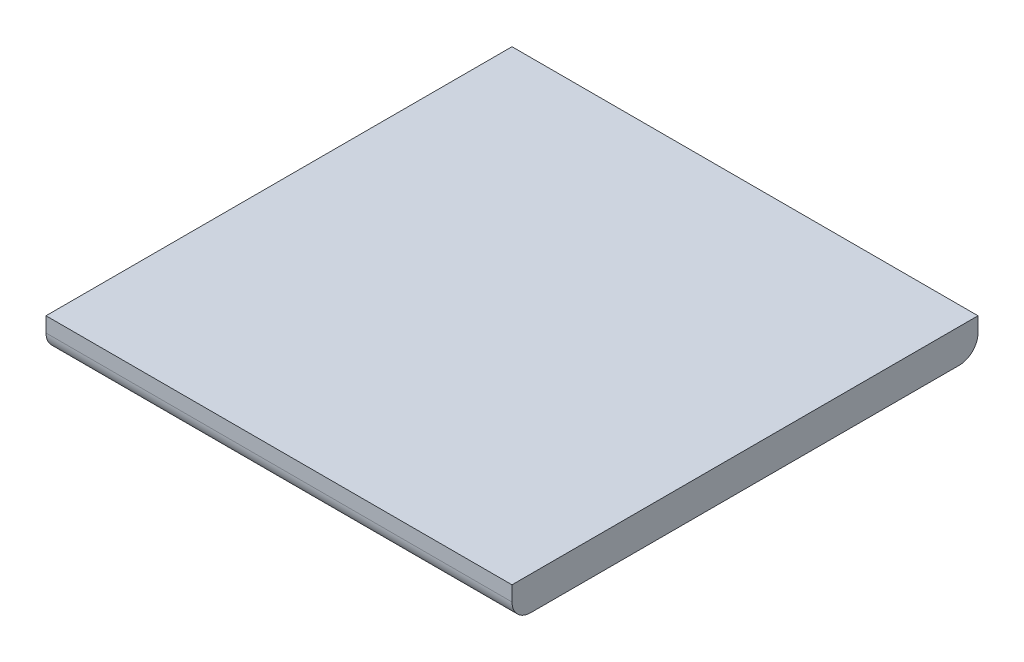
ISO-10303-21;
HEADER;
FILE_DESCRIPTION(('STEP AP214'),'2;1');
FILE_NAME('part.step','',(''),(''),'','','');
FILE_SCHEMA(('AUTOMOTIVE_DESIGN { 1 0 10303 214 1 1 1 1 }'));
ENDSEC;
DATA;
#1=APPLICATION_CONTEXT('core data for automotive mechanical design processes');
#2=APPLICATION_PROTOCOL_DEFINITION('international standard','automotive_design',2000,#1);
#3=PRODUCT_CONTEXT('',#1,'mechanical');
#4=PRODUCT('Part','Part','',(#3));
#5=PRODUCT_RELATED_PRODUCT_CATEGORY('part','',(#4));
#6=PRODUCT_DEFINITION_FORMATION('','',#4);
#7=PRODUCT_DEFINITION_CONTEXT('part definition',#1,'design');
#8=PRODUCT_DEFINITION('design','',#6,#7);
#9=PRODUCT_DEFINITION_SHAPE('','',#8);
#10=(LENGTH_UNIT() NAMED_UNIT(*) SI_UNIT(.MILLI.,.METRE.));
#11=(NAMED_UNIT(*) PLANE_ANGLE_UNIT() SI_UNIT($,.RADIAN.));
#12=(NAMED_UNIT(*) SI_UNIT($,.STERADIAN.) SOLID_ANGLE_UNIT());
#13=UNCERTAINTY_MEASURE_WITH_UNIT(LENGTH_MEASURE(1.E-05),#10,'distance_accuracy_value','');
#14=(GEOMETRIC_REPRESENTATION_CONTEXT(3) GLOBAL_UNCERTAINTY_ASSIGNED_CONTEXT((#13)) GLOBAL_UNIT_ASSIGNED_CONTEXT((#10,
#11,#12)) REPRESENTATION_CONTEXT('',''));
#15=CARTESIAN_POINT('',(0.,0.,0.));
#16=DIRECTION('',(0.,0.,1.));
#17=DIRECTION('',(1.,0.,0.));
#18=AXIS2_PLACEMENT_3D('',#15,#16,#17);
#19=CARTESIAN_POINT('',(-125.,18.,125.));
#20=DIRECTION('',(1.,0.,0.));
#21=DIRECTION('',(0.,0.,-1.));
#22=AXIS2_PLACEMENT_3D('',#19,#20,#21);
#23=PLANE('',#22);
#24=DIRECTION('',(0.,-1.,0.));
#25=VECTOR('',#24,1.);
#26=CARTESIAN_POINT('',(-125.,18.,-125.));
#27=LINE('',#26,#25);
#28=CARTESIAN_POINT('',(-125.,18.,-125.));
#29=VERTEX_POINT('',#28);
#30=CARTESIAN_POINT('',(-125.,10.,-125.));
#31=VERTEX_POINT('',#30);
#32=EDGE_CURVE('E139',#29,#31,#27,.T.);
#33=ORIENTED_EDGE('',*,*,#32,.T.);
#34=CARTESIAN_POINT('',(-125.,10.,-115.));
#35=DIRECTION('',(1.,0.,0.));
#36=DIRECTION('',(0.,0.,-1.));
#37=AXIS2_PLACEMENT_3D('',#34,#35,#36);
#38=CIRCLE('',#37,10.);
#39=CARTESIAN_POINT('',(-125.,0.,-115.));
#40=VERTEX_POINT('',#39);
#41=EDGE_CURVE('E125',#31,#40,#38,.F.);
#42=ORIENTED_EDGE('',*,*,#41,.T.);
#43=DIRECTION('',(0.,0.,1.));
#44=VECTOR('',#43,1.);
#45=CARTESIAN_POINT('',(-125.,0.,125.));
#46=LINE('',#45,#44);
#47=CARTESIAN_POINT('',(-125.,0.,115.));
#48=VERTEX_POINT('',#47);
#49=EDGE_CURVE('E141',#40,#48,#46,.T.);
#50=ORIENTED_EDGE('',*,*,#49,.T.);
#51=CARTESIAN_POINT('',(-125.,10.,115.));
#52=DIRECTION('',(1.,0.,0.));
#53=DIRECTION('',(0.,0.,-1.));
#54=AXIS2_PLACEMENT_3D('',#51,#52,#53);
#55=CIRCLE('',#54,10.);
#56=CARTESIAN_POINT('',(-125.,10.,125.));
#57=VERTEX_POINT('',#56);
#58=EDGE_CURVE('E115',#48,#57,#55,.F.);
#59=ORIENTED_EDGE('',*,*,#58,.T.);
#60=DIRECTION('',(0.,-1.,0.));
#61=VECTOR('',#60,1.);
#62=CARTESIAN_POINT('',(-125.,18.,125.));
#63=LINE('',#62,#61);
#64=CARTESIAN_POINT('',(-125.,18.,125.));
#65=VERTEX_POINT('',#64);
#66=EDGE_CURVE('E96',#65,#57,#63,.T.);
#67=ORIENTED_EDGE('',*,*,#66,.F.);
#68=DIRECTION('',(0.,0.,1.));
#69=VECTOR('',#68,1.);
#70=CARTESIAN_POINT('',(-125.,18.,125.));
#71=LINE('',#70,#69);
#72=EDGE_CURVE('E102',#29,#65,#71,.T.);
#73=ORIENTED_EDGE('',*,*,#72,.F.);
#74=EDGE_LOOP('',(#33,#42,#50,#59,#67,#73));
#75=FACE_BOUND('',#74,.T.);
#76=ADVANCED_FACE('F37',(#75),#23,.F.);
#77=CARTESIAN_POINT('',(-125.,18.,125.));
#78=DIRECTION('',(0.,0.,-1.));
#79=DIRECTION('',(-1.,0.,0.));
#80=AXIS2_PLACEMENT_3D('',#77,#78,#79);
#81=PLANE('',#80);
#82=ORIENTED_EDGE('',*,*,#66,.T.);
#83=DIRECTION('',(1.,0.,0.));
#84=VECTOR('',#83,1.);
#85=CARTESIAN_POINT('',(125.,10.,125.));
#86=LINE('',#85,#84);
#87=CARTESIAN_POINT('',(125.,10.,125.));
#88=VERTEX_POINT('',#87);
#89=EDGE_CURVE('E11',#57,#88,#86,.T.);
#90=ORIENTED_EDGE('',*,*,#89,.T.);
#91=DIRECTION('',(0.,-1.,0.));
#92=VECTOR('',#91,1.);
#93=CARTESIAN_POINT('',(125.,18.,125.));
#94=LINE('',#93,#92);
#95=CARTESIAN_POINT('',(125.,18.,125.));
#96=VERTEX_POINT('',#95);
#97=EDGE_CURVE('E98',#96,#88,#94,.T.);
#98=ORIENTED_EDGE('',*,*,#97,.F.);
#99=DIRECTION('',(1.,0.,0.));
#100=VECTOR('',#99,1.);
#101=CARTESIAN_POINT('',(-125.,18.,125.));
#102=LINE('',#101,#100);
#103=EDGE_CURVE('E92',#65,#96,#102,.T.);
#104=ORIENTED_EDGE('',*,*,#103,.F.);
#105=EDGE_LOOP('',(#82,#90,#98,#104));
#106=FACE_BOUND('',#105,.T.);
#107=ADVANCED_FACE('F94',(#106),#81,.F.);
#108=CARTESIAN_POINT('',(125.,18.,125.));
#109=DIRECTION('',(-1.,0.,0.));
#110=DIRECTION('',(0.,0.,1.));
#111=AXIS2_PLACEMENT_3D('',#108,#109,#110);
#112=PLANE('',#111);
#113=DIRECTION('',(0.,0.,-1.));
#114=VECTOR('',#113,1.);
#115=CARTESIAN_POINT('',(125.,0.,125.));
#116=LINE('',#115,#114);
#117=CARTESIAN_POINT('',(125.,0.,115.));
#118=VERTEX_POINT('',#117);
#119=CARTESIAN_POINT('',(125.,0.,-115.));
#120=VERTEX_POINT('',#119);
#121=EDGE_CURVE('E111',#118,#120,#116,.T.);
#122=ORIENTED_EDGE('',*,*,#121,.T.);
#123=CARTESIAN_POINT('',(125.,10.,-115.));
#124=DIRECTION('',(-1.,0.,0.));
#125=DIRECTION('',(0.,0.,1.));
#126=AXIS2_PLACEMENT_3D('',#123,#124,#125);
#127=CIRCLE('',#126,10.);
#128=CARTESIAN_POINT('',(125.,10.,-125.));
#129=VERTEX_POINT('',#128);
#130=EDGE_CURVE('E45',#120,#129,#127,.F.);
#131=ORIENTED_EDGE('',*,*,#130,.T.);
#132=DIRECTION('',(0.,-1.,0.));
#133=VECTOR('',#132,1.);
#134=CARTESIAN_POINT('',(125.,18.,-125.));
#135=LINE('',#134,#133);
#136=CARTESIAN_POINT('',(125.,18.,-125.));
#137=VERTEX_POINT('',#136);
#138=EDGE_CURVE('E120',#137,#129,#135,.T.);
#139=ORIENTED_EDGE('',*,*,#138,.F.);
#140=DIRECTION('',(0.,0.,-1.));
#141=VECTOR('',#140,1.);
#142=CARTESIAN_POINT('',(125.,18.,125.));
#143=LINE('',#142,#141);
#144=EDGE_CURVE('E101',#96,#137,#143,.T.);
#145=ORIENTED_EDGE('',*,*,#144,.F.);
#146=ORIENTED_EDGE('',*,*,#97,.T.);
#147=CARTESIAN_POINT('',(125.,10.,115.));
#148=DIRECTION('',(-1.,0.,0.));
#149=DIRECTION('',(0.,0.,1.));
#150=AXIS2_PLACEMENT_3D('',#147,#148,#149);
#151=CIRCLE('',#150,10.);
#152=EDGE_CURVE('E52',#88,#118,#151,.F.);
#153=ORIENTED_EDGE('',*,*,#152,.T.);
#154=EDGE_LOOP('',(#122,#131,#139,#145,#146,#153));
#155=FACE_BOUND('',#154,.T.);
#156=ADVANCED_FACE('F134',(#155),#112,.F.);
#157=CARTESIAN_POINT('',(-125.,18.,-125.));
#158=DIRECTION('',(0.,0.,1.));
#159=DIRECTION('',(1.,0.,0.));
#160=AXIS2_PLACEMENT_3D('',#157,#158,#159);
#161=PLANE('',#160);
#162=ORIENTED_EDGE('',*,*,#138,.T.);
#163=DIRECTION('',(-1.,0.,0.));
#164=VECTOR('',#163,1.);
#165=CARTESIAN_POINT('',(-125.,10.,-125.));
#166=LINE('',#165,#164);
#167=EDGE_CURVE('E116',#129,#31,#166,.T.);
#168=ORIENTED_EDGE('',*,*,#167,.T.);
#169=ORIENTED_EDGE('',*,*,#32,.F.);
#170=DIRECTION('',(-1.,0.,0.));
#171=VECTOR('',#170,1.);
#172=CARTESIAN_POINT('',(-125.,18.,-125.));
#173=LINE('',#172,#171);
#174=EDGE_CURVE('E107',#137,#29,#173,.T.);
#175=ORIENTED_EDGE('',*,*,#174,.F.);
#176=EDGE_LOOP('',(#162,#168,#169,#175));
#177=FACE_BOUND('',#176,.T.);
#178=ADVANCED_FACE('F138',(#177),#161,.F.);
#179=CARTESIAN_POINT('',(0.,18.,0.));
#180=DIRECTION('',(0.,-1.,0.));
#181=DIRECTION('',(0.,0.,-1.));
#182=AXIS2_PLACEMENT_3D('',#179,#180,#181);
#183=PLANE('',#182);
#184=ORIENTED_EDGE('',*,*,#72,.T.);
#185=ORIENTED_EDGE('',*,*,#103,.T.);
#186=ORIENTED_EDGE('',*,*,#144,.T.);
#187=ORIENTED_EDGE('',*,*,#174,.T.);
#188=EDGE_LOOP('',(#184,#185,#186,#187));
#189=FACE_BOUND('',#188,.T.);
#190=ADVANCED_FACE('F105',(#189),#183,.F.);
#191=CARTESIAN_POINT('',(0.,0.,0.));
#192=DIRECTION('',(0.,-1.,0.));
#193=DIRECTION('',(0.,0.,-1.));
#194=AXIS2_PLACEMENT_3D('',#191,#192,#193);
#195=PLANE('',#194);
#196=ORIENTED_EDGE('',*,*,#49,.F.);
#197=DIRECTION('',(-1.,0.,0.));
#198=VECTOR('',#197,1.);
#199=CARTESIAN_POINT('',(125.,0.,-115.));
#200=LINE('',#199,#198);
#201=EDGE_CURVE('E59',#40,#120,#200,.F.);
#202=ORIENTED_EDGE('',*,*,#201,.T.);
#203=ORIENTED_EDGE('',*,*,#121,.F.);
#204=DIRECTION('',(1.,0.,0.));
#205=VECTOR('',#204,1.);
#206=CARTESIAN_POINT('',(-125.,0.,115.));
#207=LINE('',#206,#205);
#208=EDGE_CURVE('E127',#118,#48,#207,.F.);
#209=ORIENTED_EDGE('',*,*,#208,.T.);
#210=EDGE_LOOP('',(#196,#202,#203,#209));
#211=FACE_BOUND('',#210,.T.);
#212=ADVANCED_FACE('F142',(#211),#195,.T.);
#213=CARTESIAN_POINT('',(-125.,10.,-115.));
#214=DIRECTION('',(1.,0.,0.));
#215=DIRECTION('',(0.,0.,-1.));
#216=AXIS2_PLACEMENT_3D('',#213,#214,#215);
#217=CYLINDRICAL_SURFACE('',#216,10.);
#218=ORIENTED_EDGE('',*,*,#130,.F.);
#219=ORIENTED_EDGE('',*,*,#201,.F.);
#220=ORIENTED_EDGE('',*,*,#41,.F.);
#221=ORIENTED_EDGE('',*,*,#167,.F.);
#222=EDGE_LOOP('',(#218,#219,#220,#221));
#223=FACE_BOUND('',#222,.T.);
#224=ADVANCED_FACE('F140',(#223),#217,.T.);
#225=CARTESIAN_POINT('',(-125.,10.,115.));
#226=DIRECTION('',(-1.,0.,0.));
#227=DIRECTION('',(0.,0.,1.));
#228=AXIS2_PLACEMENT_3D('',#225,#226,#227);
#229=CYLINDRICAL_SURFACE('',#228,10.);
#230=ORIENTED_EDGE('',*,*,#58,.F.);
#231=ORIENTED_EDGE('',*,*,#208,.F.);
#232=ORIENTED_EDGE('',*,*,#152,.F.);
#233=ORIENTED_EDGE('',*,*,#89,.F.);
#234=EDGE_LOOP('',(#230,#231,#232,#233));
#235=FACE_BOUND('',#234,.T.);
#236=ADVANCED_FACE('F39',(#235),#229,.T.);
#237=CLOSED_SHELL('',(#76,#107,#156,#178,#190,#212,#224,#236));
#238=MANIFOLD_SOLID_BREP('B2',#237);
#239=ADVANCED_BREP_SHAPE_REPRESENTATION('',(#18,#238),#14);
#240=SHAPE_DEFINITION_REPRESENTATION(#9,#239);
ENDSEC;
END-ISO-10303-21;
